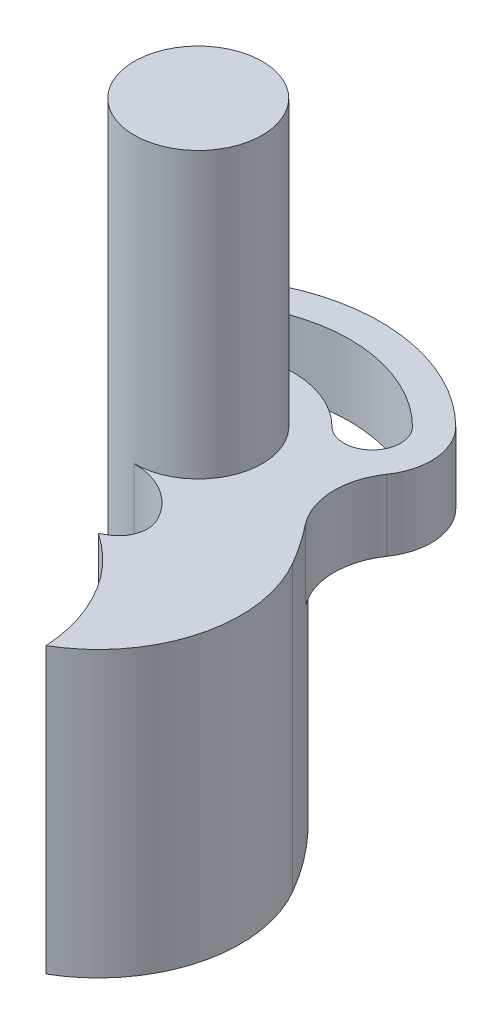
ISO-10303-21;
HEADER;
FILE_DESCRIPTION(('STEP AP214'),'2;1');
FILE_NAME('part.step','',(''),(''),'','','');
FILE_SCHEMA(('AUTOMOTIVE_DESIGN { 1 0 10303 214 1 1 1 1 }'));
ENDSEC;
DATA;
#1=APPLICATION_CONTEXT('core data for automotive mechanical design processes');
#2=APPLICATION_PROTOCOL_DEFINITION('international standard','automotive_design',2000,#1);
#3=PRODUCT_CONTEXT('',#1,'mechanical');
#4=PRODUCT('Part','Part','',(#3));
#5=PRODUCT_RELATED_PRODUCT_CATEGORY('part','',(#4));
#6=PRODUCT_DEFINITION_FORMATION('','',#4);
#7=PRODUCT_DEFINITION_CONTEXT('part definition',#1,'design');
#8=PRODUCT_DEFINITION('design','',#6,#7);
#9=PRODUCT_DEFINITION_SHAPE('','',#8);
#10=(LENGTH_UNIT() NAMED_UNIT(*) SI_UNIT(.MILLI.,.METRE.));
#11=(NAMED_UNIT(*) PLANE_ANGLE_UNIT() SI_UNIT($,.RADIAN.));
#12=(NAMED_UNIT(*) SI_UNIT($,.STERADIAN.) SOLID_ANGLE_UNIT());
#13=UNCERTAINTY_MEASURE_WITH_UNIT(LENGTH_MEASURE(1.E-05),#10,'distance_accuracy_value','');
#14=(GEOMETRIC_REPRESENTATION_CONTEXT(3) GLOBAL_UNCERTAINTY_ASSIGNED_CONTEXT((#13)) GLOBAL_UNIT_ASSIGNED_CONTEXT((#10,
#11,#12)) REPRESENTATION_CONTEXT('',''));
#15=CARTESIAN_POINT('',(0.,0.,0.));
#16=DIRECTION('',(0.,0.,1.));
#17=DIRECTION('',(1.,0.,0.));
#18=AXIS2_PLACEMENT_3D('',#15,#16,#17);
#19=CARTESIAN_POINT('',(0.,-20.,-17.5));
#20=DIRECTION('',(0.,1.,0.));
#21=DIRECTION('',(0.,0.,1.));
#22=AXIS2_PLACEMENT_3D('',#19,#20,#21);
#23=CYLINDRICAL_SURFACE('',#22,4.5);
#24=CARTESIAN_POINT('',(0.,20.,-17.5));
#25=DIRECTION('',(0.,1.,0.));
#26=DIRECTION('',(0.,0.,1.));
#27=AXIS2_PLACEMENT_3D('',#24,#25,#26);
#28=CIRCLE('',#27,4.5);
#29=CARTESIAN_POINT('',(0.,20.,-13.));
#30=VERTEX_POINT('',#29);
#31=EDGE_CURVE('E228',#30,#30,#28,.T.);
#32=ORIENTED_EDGE('',*,*,#31,.F.);
#33=EDGE_LOOP('',(#32));
#34=FACE_BOUND('',#33,.T.);
#35=CARTESIAN_POINT('',(0.,0.,-17.5));
#36=DIRECTION('',(0.,1.,0.));
#37=DIRECTION('',(0.,0.,1.));
#38=AXIS2_PLACEMENT_3D('',#35,#36,#37);
#39=CIRCLE('',#38,4.5);
#40=CARTESIAN_POINT('',(0.,0.,-13.));
#41=VERTEX_POINT('',#40);
#42=CARTESIAN_POINT('',(-4.48051561250782,0.,-17.0816940759759));
#43=VERTEX_POINT('',#42);
#44=EDGE_CURVE('E227',#41,#43,#39,.T.);
#45=ORIENTED_EDGE('',*,*,#44,.T.);
#46=DIRECTION('',(0.,1.,0.));
#47=VECTOR('',#46,1.);
#48=CARTESIAN_POINT('',(-4.48051561250782,-20.,-17.0816940759759));
#49=LINE('',#48,#47);
#50=CARTESIAN_POINT('',(-4.48051561250769,-5.,-17.0816940759759));
#51=VERTEX_POINT('',#50);
#52=EDGE_CURVE('E282',#43,#51,#49,.F.);
#53=ORIENTED_EDGE('',*,*,#52,.T.);
#54=CARTESIAN_POINT('',(1.43982048506075E-13,-5.,-17.5));
#55=DIRECTION('',(0.,-1.,0.));
#56=DIRECTION('',(0.,0.,1.));
#57=AXIS2_PLACEMENT_3D('',#54,#55,#56);
#58=CIRCLE('',#57,4.50000000000001);
#59=CARTESIAN_POINT('',(1.99233572089606,-5.,-21.5349223505839));
#60=VERTEX_POINT('',#59);
#61=EDGE_CURVE('E212',#51,#60,#58,.T.);
#62=ORIENTED_EDGE('',*,*,#61,.T.);
#63=DIRECTION('',(0.,1.,0.));
#64=VECTOR('',#63,1.);
#65=CARTESIAN_POINT('',(1.99233572089606,-20.,-21.5349223505839));
#66=LINE('',#65,#64);
#67=CARTESIAN_POINT('',(1.99233572089606,-20.,-21.5349223505839));
#68=VERTEX_POINT('',#67);
#69=EDGE_CURVE('E248',#68,#60,#66,.T.);
#70=ORIENTED_EDGE('',*,*,#69,.F.);
#71=CARTESIAN_POINT('',(0.,-20.,-17.5));
#72=DIRECTION('',(0.,1.,0.));
#73=DIRECTION('',(0.,0.,1.));
#74=AXIS2_PLACEMENT_3D('',#71,#72,#73);
#75=CIRCLE('',#74,4.5);
#76=CARTESIAN_POINT('',(0.,-20.,-13.));
#77=VERTEX_POINT('',#76);
#78=EDGE_CURVE('E236',#68,#77,#75,.T.);
#79=ORIENTED_EDGE('',*,*,#78,.T.);
#80=DIRECTION('',(0.,1.,0.));
#81=VECTOR('',#80,1.);
#82=CARTESIAN_POINT('',(0.,-20.,-13.));
#83=LINE('',#82,#81);
#84=EDGE_CURVE('E266',#77,#41,#83,.T.);
#85=ORIENTED_EDGE('',*,*,#84,.T.);
#86=EDGE_LOOP('',(#45,#53,#62,#70,#79,#85));
#87=FACE_BOUND('',#86,.T.);
#88=ADVANCED_FACE('F41',(#34,#87),#23,.T.);
#89=CARTESIAN_POINT('',(-8.09912658383888,-20.,-1.09746977851601));
#90=DIRECTION('',(0.,1.,0.));
#91=DIRECTION('',(0.,0.,1.));
#92=AXIS2_PLACEMENT_3D('',#89,#90,#91);
#93=CYLINDRICAL_SURFACE('',#92,22.7931366661855);
#94=CARTESIAN_POINT('',(-8.09912658383888,-5.,-1.09746977851601));
#95=DIRECTION('',(0.,1.,0.));
#96=DIRECTION('',(0.,0.,1.));
#97=AXIS2_PLACEMENT_3D('',#94,#95,#96);
#98=CIRCLE('',#97,22.7931366661855);
#99=CARTESIAN_POINT('',(9.7310619005618,-5.,-15.2964647321793));
#100=VERTEX_POINT('',#99);
#101=EDGE_CURVE('E223',#60,#100,#98,.F.);
#102=ORIENTED_EDGE('',*,*,#101,.T.);
#103=DIRECTION('',(0.,1.,0.));
#104=VECTOR('',#103,1.);
#105=CARTESIAN_POINT('',(9.7310619005618,-20.,-15.2964647321793));
#106=LINE('',#105,#104);
#107=CARTESIAN_POINT('',(9.73106190056181,0.,-15.2964647321793));
#108=VERTEX_POINT('',#107);
#109=EDGE_CURVE('E277',#100,#108,#106,.T.);
#110=ORIENTED_EDGE('',*,*,#109,.T.);
#111=CARTESIAN_POINT('',(-8.09912658383888,0.,-1.09746977851601));
#112=DIRECTION('',(0.,1.,0.));
#113=DIRECTION('',(0.,0.,1.));
#114=AXIS2_PLACEMENT_3D('',#111,#112,#113);
#115=CIRCLE('',#114,22.7931366661855);
#116=CARTESIAN_POINT('',(11.6403088010083,0.,-12.4940381116088));
#117=VERTEX_POINT('',#116);
#118=EDGE_CURVE('E231',#117,#108,#115,.T.);
#119=ORIENTED_EDGE('',*,*,#118,.F.);
#120=DIRECTION('',(0.,1.,0.));
#121=VECTOR('',#120,1.);
#122=CARTESIAN_POINT('',(11.6403088010083,-20.,-12.4940381116088));
#123=LINE('',#122,#121);
#124=CARTESIAN_POINT('',(11.6403088010083,-20.,-12.4940381116088));
#125=VERTEX_POINT('',#124);
#126=EDGE_CURVE('E257',#125,#117,#123,.T.);
#127=ORIENTED_EDGE('',*,*,#126,.F.);
#128=CARTESIAN_POINT('',(-8.09912658383888,-20.,-1.09746977851601));
#129=DIRECTION('',(0.,1.,0.));
#130=DIRECTION('',(0.,0.,1.));
#131=AXIS2_PLACEMENT_3D('',#128,#129,#130);
#132=CIRCLE('',#131,22.7931366661855);
#133=EDGE_CURVE('E233',#125,#68,#132,.T.);
#134=ORIENTED_EDGE('',*,*,#133,.T.);
#135=ORIENTED_EDGE('',*,*,#69,.T.);
#136=EDGE_LOOP('',(#102,#110,#119,#127,#134,#135));
#137=FACE_BOUND('',#136,.T.);
#138=ADVANCED_FACE('F324',(#137),#93,.T.);
#139=CARTESIAN_POINT('',(-3.24759526419164,-20.,1.875));
#140=DIRECTION('',(0.,1.,0.));
#141=DIRECTION('',(0.,0.,1.));
#142=AXIS2_PLACEMENT_3D('',#139,#140,#141);
#143=CYLINDRICAL_SURFACE('',#142,11.25);
#144=CARTESIAN_POINT('',(-3.24759526419164,0.,1.875));
#145=DIRECTION('',(0.,1.,0.));
#146=DIRECTION('',(0.,0.,1.));
#147=AXIS2_PLACEMENT_3D('',#144,#145,#146);
#148=CIRCLE('',#147,11.25);
#149=CARTESIAN_POINT('',(2.98005476316394,0.,-7.49403811160878));
#150=VERTEX_POINT('',#149);
#151=CARTESIAN_POINT('',(7.98005476316394,0.,1.1662159262356));
#152=VERTEX_POINT('',#151);
#153=EDGE_CURVE('E237',#150,#152,#148,.F.);
#154=ORIENTED_EDGE('',*,*,#153,.F.);
#155=DIRECTION('',(0.,1.,0.));
#156=VECTOR('',#155,1.);
#157=CARTESIAN_POINT('',(2.98005476316394,-20.,-7.49403811160878));
#158=LINE('',#157,#156);
#159=CARTESIAN_POINT('',(2.98005476316394,-20.,-7.49403811160878));
#160=VERTEX_POINT('',#159);
#161=EDGE_CURVE('E264',#160,#150,#158,.T.);
#162=ORIENTED_EDGE('',*,*,#161,.F.);
#163=CARTESIAN_POINT('',(-3.24759526419164,-20.,1.875));
#164=DIRECTION('',(0.,1.,0.));
#165=DIRECTION('',(0.,0.,1.));
#166=AXIS2_PLACEMENT_3D('',#163,#164,#165);
#167=CIRCLE('',#166,11.25);
#168=CARTESIAN_POINT('',(7.98005476316394,-20.,1.1662159262356));
#169=VERTEX_POINT('',#168);
#170=EDGE_CURVE('E245',#160,#169,#167,.F.);
#171=ORIENTED_EDGE('',*,*,#170,.T.);
#172=DIRECTION('',(0.,1.,0.));
#173=VECTOR('',#172,1.);
#174=CARTESIAN_POINT('',(7.98005476316394,-20.,1.1662159262356));
#175=LINE('',#174,#173);
#176=EDGE_CURVE('E261',#169,#152,#175,.T.);
#177=ORIENTED_EDGE('',*,*,#176,.T.);
#178=EDGE_LOOP('',(#154,#162,#171,#177));
#179=FACE_BOUND('',#178,.T.);
#180=ADVANCED_FACE('F331',(#179),#143,.F.);
#181=CARTESIAN_POINT('',(-2.5,-20.,-4.33012701892219));
#182=DIRECTION('',(0.5,0.,0.866025403784439));
#183=DIRECTION('',(0.866025403784439,0.,-0.5));
#184=AXIS2_PLACEMENT_3D('',#181,#182,#183);
#185=PLANE('',#184);
#186=DIRECTION('',(0.866025403784439,0.,-0.5));
#187=VECTOR('',#186,1.);
#188=CARTESIAN_POINT('',(-2.5,0.,-4.33012701892219));
#189=LINE('',#188,#187);
#190=CARTESIAN_POINT('',(3.43475820135043,0.,-7.7565612640472));
#191=VERTEX_POINT('',#190);
#192=EDGE_CURVE('E253',#150,#191,#189,.T.);
#193=ORIENTED_EDGE('',*,*,#192,.T.);
#194=DIRECTION('',(0.,1.,0.));
#195=VECTOR('',#194,1.);
#196=CARTESIAN_POINT('',(3.43475820135043,-20.,-7.7565612640472));
#197=LINE('',#196,#195);
#198=CARTESIAN_POINT('',(3.43475820135043,-20.,-7.7565612640472));
#199=VERTEX_POINT('',#198);
#200=EDGE_CURVE('E56',#191,#199,#197,.F.);
#201=ORIENTED_EDGE('',*,*,#200,.T.);
#202=DIRECTION('',(0.866025403784439,0.,-0.5));
#203=VECTOR('',#202,1.);
#204=CARTESIAN_POINT('',(-2.5,-20.,-4.33012701892219));
#205=LINE('',#204,#203);
#206=EDGE_CURVE('E243',#160,#199,#205,.T.);
#207=ORIENTED_EDGE('',*,*,#206,.F.);
#208=ORIENTED_EDGE('',*,*,#161,.T.);
#209=EDGE_LOOP('',(#193,#201,#207,#208));
#210=FACE_BOUND('',#209,.T.);
#211=ADVANCED_FACE('F374',(#210),#185,.F.);
#212=CARTESIAN_POINT('',(0.,-20.,-8.28317898572572));
#213=DIRECTION('',(0.,1.,0.));
#214=DIRECTION('',(0.,0.,1.));
#215=AXIS2_PLACEMENT_3D('',#212,#213,#214);
#216=CYLINDRICAL_SURFACE('',#215,4.71682101427428);
#217=CARTESIAN_POINT('',(0.,-20.,-8.28317898572572));
#218=DIRECTION('',(0.,1.,0.));
#219=DIRECTION('',(0.,0.,1.));
#220=AXIS2_PLACEMENT_3D('',#217,#218,#219);
#221=CIRCLE('',#220,4.71682101427428);
#222=CARTESIAN_POINT('',(4.2271163939278,-20.,-10.3759970554313));
#223=VERTEX_POINT('',#222);
#224=EDGE_CURVE('E240',#77,#223,#221,.F.);
#225=ORIENTED_EDGE('',*,*,#224,.T.);
#226=DIRECTION('',(0.,1.,0.));
#227=VECTOR('',#226,1.);
#228=CARTESIAN_POINT('',(4.2271163939278,-20.,-10.3759970554313));
#229=LINE('',#228,#227);
#230=CARTESIAN_POINT('',(4.2271163939278,0.,-10.3759970554313));
#231=VERTEX_POINT('',#230);
#232=EDGE_CURVE('E295',#223,#231,#229,.T.);
#233=ORIENTED_EDGE('',*,*,#232,.T.);
#234=CARTESIAN_POINT('',(0.,0.,-8.28317898572572));
#235=DIRECTION('',(0.,1.,0.));
#236=DIRECTION('',(0.,0.,1.));
#237=AXIS2_PLACEMENT_3D('',#234,#235,#236);
#238=CIRCLE('',#237,4.71682101427428);
#239=EDGE_CURVE('E251',#41,#231,#238,.F.);
#240=ORIENTED_EDGE('',*,*,#239,.F.);
#241=ORIENTED_EDGE('',*,*,#84,.F.);
#242=EDGE_LOOP('',(#225,#233,#240,#241));
#243=FACE_BOUND('',#242,.T.);
#244=ADVANCED_FACE('F300',(#243),#216,.F.);
#245=CARTESIAN_POINT('',(0.,-20.,0.));
#246=DIRECTION('',(0.,1.,0.));
#247=DIRECTION('',(0.,0.,1.));
#248=AXIS2_PLACEMENT_3D('',#245,#246,#247);
#249=PLANE('',#248);
#250=ORIENTED_EDGE('',*,*,#133,.F.);
#251=CARTESIAN_POINT('',(2.98005476316394,-20.,-7.49403811160878));
#252=DIRECTION('',(0.,1.,0.));
#253=DIRECTION('',(0.,0.,1.));
#254=AXIS2_PLACEMENT_3D('',#251,#252,#253);
#255=CIRCLE('',#254,10.);
#256=EDGE_CURVE('E272',#125,#169,#255,.F.);
#257=ORIENTED_EDGE('',*,*,#256,.T.);
#258=ORIENTED_EDGE('',*,*,#170,.F.);
#259=ORIENTED_EDGE('',*,*,#206,.T.);
#260=CARTESIAN_POINT('',(2.43475820135043,-20.,-9.48861207161608));
#261=DIRECTION('',(0.,1.,0.));
#262=DIRECTION('',(0.,0.,1.));
#263=AXIS2_PLACEMENT_3D('',#260,#261,#262);
#264=CIRCLE('',#263,2.);
#265=EDGE_CURVE('E11',#199,#223,#264,.T.);
#266=ORIENTED_EDGE('',*,*,#265,.T.);
#267=ORIENTED_EDGE('',*,*,#224,.F.);
#268=ORIENTED_EDGE('',*,*,#78,.F.);
#269=EDGE_LOOP('',(#250,#257,#258,#259,#266,#267,#268));
#270=FACE_BOUND('',#269,.T.);
#271=ADVANCED_FACE('F313',(#270),#249,.F.);
#272=CARTESIAN_POINT('',(0.,0.,0.));
#273=DIRECTION('',(0.,1.,0.));
#274=DIRECTION('',(0.,0.,1.));
#275=AXIS2_PLACEMENT_3D('',#272,#273,#274);
#276=PLANE('',#275);
#277=ORIENTED_EDGE('',*,*,#118,.T.);
#278=CARTESIAN_POINT('',(13.6423683489745,0.,-18.4112170283668));
#279=DIRECTION('',(0.,1.,0.));
#280=DIRECTION('',(0.,0.,1.));
#281=AXIS2_PLACEMENT_3D('',#278,#279,#280);
#282=CIRCLE('',#281,5.);
#283=CARTESIAN_POINT('',(9.53029472026864,0.,-21.2556590601371));
#284=VERTEX_POINT('',#283);
#285=EDGE_CURVE('E288',#108,#284,#282,.F.);
#286=ORIENTED_EDGE('',*,*,#285,.T.);
#287=CARTESIAN_POINT('',(6.11684347939477,0.,-23.6168434793947));
#288=DIRECTION('',(0.,1.,0.));
#289=DIRECTION('',(0.,0.,1.));
#290=AXIS2_PLACEMENT_3D('',#287,#288,#289);
#291=CIRCLE('',#290,4.15052300747366);
#292=CARTESIAN_POINT('',(9.0517064434504,0.,-26.5517064434503));
#293=VERTEX_POINT('',#292);
#294=EDGE_CURVE('E199',#284,#293,#291,.T.);
#295=ORIENTED_EDGE('',*,*,#294,.T.);
#296=CARTESIAN_POINT('',(1.43982048506075E-13,0.,-17.5));
#297=DIRECTION('',(0.,1.,0.));
#298=DIRECTION('',(0.,0.,1.));
#299=AXIS2_PLACEMENT_3D('',#296,#297,#298);
#300=CIRCLE('',#299,12.8010460149473);
#301=CARTESIAN_POINT('',(-7.3423783548191,0.,-27.9860030121815));
#302=VERTEX_POINT('',#301);
#303=EDGE_CURVE('E216',#293,#302,#300,.T.);
#304=ORIENTED_EDGE('',*,*,#303,.T.);
#305=CARTESIAN_POINT('',(-4.96173615919924,0.,-24.5860936057409));
#306=DIRECTION('',(0.,1.,0.));
#307=DIRECTION('',(0.,0.,1.));
#308=AXIS2_PLACEMENT_3D('',#305,#306,#307);
#309=CIRCLE('',#308,4.15052300747364);
#310=CARTESIAN_POINT('',(-7.0015585904414,0.,-20.9714061110092));
#311=VERTEX_POINT('',#310);
#312=EDGE_CURVE('E206',#302,#311,#309,.T.);
#313=ORIENTED_EDGE('',*,*,#312,.T.);
#314=CARTESIAN_POINT('',(-9.45886629307206,0.,-16.6169097159491));
#315=DIRECTION('',(0.,1.,0.));
#316=DIRECTION('',(0.,0.,1.));
#317=AXIS2_PLACEMENT_3D('',#314,#315,#316);
#318=CIRCLE('',#317,5.);
#319=EDGE_CURVE('E290',#311,#43,#318,.F.);
#320=ORIENTED_EDGE('',*,*,#319,.T.);
#321=ORIENTED_EDGE('',*,*,#44,.F.);
#322=ORIENTED_EDGE('',*,*,#239,.T.);
#323=CARTESIAN_POINT('',(2.43475820135043,0.,-9.48861207161608));
#324=DIRECTION('',(0.,1.,0.));
#325=DIRECTION('',(0.,0.,1.));
#326=AXIS2_PLACEMENT_3D('',#323,#324,#325);
#327=CIRCLE('',#326,2.);
#328=EDGE_CURVE('E49',#231,#191,#327,.F.);
#329=ORIENTED_EDGE('',*,*,#328,.T.);
#330=ORIENTED_EDGE('',*,*,#192,.F.);
#331=ORIENTED_EDGE('',*,*,#153,.T.);
#332=CARTESIAN_POINT('',(2.98005476316394,0.,-7.49403811160878));
#333=DIRECTION('',(0.,1.,0.));
#334=DIRECTION('',(0.,0.,1.));
#335=AXIS2_PLACEMENT_3D('',#332,#333,#334);
#336=CIRCLE('',#335,10.);
#337=EDGE_CURVE('E260',#152,#117,#336,.T.);
#338=ORIENTED_EDGE('',*,*,#337,.T.);
#339=EDGE_LOOP('',(#277,#286,#295,#304,#313,#320,#321,#322,#329,#330,#331,#338));
#340=FACE_BOUND('',#339,.T.);
#341=CARTESIAN_POINT('',(6.11684347939477,0.,-23.6168434793947));
#342=DIRECTION('',(0.,1.,0.));
#343=DIRECTION('',(0.,0.,1.));
#344=AXIS2_PLACEMENT_3D('',#341,#342,#343);
#345=CIRCLE('',#344,2.);
#346=CARTESIAN_POINT('',(4.7026299170217,0.,-22.2026299170217));
#347=VERTEX_POINT('',#346);
#348=CARTESIAN_POINT('',(7.53105704176793,0.,-25.0310570417679));
#349=VERTEX_POINT('',#348);
#350=EDGE_CURVE('E167',#347,#349,#345,.T.);
#351=ORIENTED_EDGE('',*,*,#350,.F.);
#352=CARTESIAN_POINT('',(1.43982048506075E-13,0.,-17.5));
#353=DIRECTION('',(0.,-1.,0.));
#354=DIRECTION('',(0.,0.,1.));
#355=AXIS2_PLACEMENT_3D('',#352,#353,#354);
#356=CIRCLE('',#355,6.65052300747346);
#357=CARTESIAN_POINT('',(-3.81458328649726,0.,-22.9477895171631));
#358=VERTEX_POINT('',#357);
#359=EDGE_CURVE('E184',#358,#347,#356,.T.);
#360=ORIENTED_EDGE('',*,*,#359,.F.);
#361=CARTESIAN_POINT('',(-4.96173615919936,0.,-24.5860936057411));
#362=DIRECTION('',(0.,1.,0.));
#363=DIRECTION('',(0.,0.,1.));
#364=AXIS2_PLACEMENT_3D('',#361,#362,#363);
#365=CIRCLE('',#364,2.);
#366=CARTESIAN_POINT('',(-6.1088890319013,0.,-26.2243976943188));
#367=VERTEX_POINT('',#366);
#368=EDGE_CURVE('E187',#367,#358,#365,.T.);
#369=ORIENTED_EDGE('',*,*,#368,.F.);
#370=CARTESIAN_POINT('',(1.43982048506075E-13,0.,-17.5));
#371=DIRECTION('',(0.,1.,0.));
#372=DIRECTION('',(0.,0.,1.));
#373=AXIS2_PLACEMENT_3D('',#370,#371,#372);
#374=CIRCLE('',#373,10.6505230074735);
#375=EDGE_CURVE('E193',#349,#367,#374,.T.);
#376=ORIENTED_EDGE('',*,*,#375,.F.);
#377=EDGE_LOOP('',(#351,#360,#369,#376));
#378=FACE_BOUND('',#377,.T.);
#379=ADVANCED_FACE('F305',(#340,#378),#276,.T.);
#380=CARTESIAN_POINT('',(2.98005476316394,-20.,-7.49403811160878));
#381=DIRECTION('',(0.,1.,0.));
#382=DIRECTION('',(0.,0.,1.));
#383=AXIS2_PLACEMENT_3D('',#380,#381,#382);
#384=CYLINDRICAL_SURFACE('',#383,10.);
#385=ORIENTED_EDGE('',*,*,#256,.F.);
#386=ORIENTED_EDGE('',*,*,#126,.T.);
#387=ORIENTED_EDGE('',*,*,#337,.F.);
#388=ORIENTED_EDGE('',*,*,#176,.F.);
#389=EDGE_LOOP('',(#385,#386,#387,#388));
#390=FACE_BOUND('',#389,.T.);
#391=ADVANCED_FACE('F338',(#390),#384,.T.);
#392=CARTESIAN_POINT('',(0.,20.,-17.5));
#393=DIRECTION('',(0.,1.,0.));
#394=DIRECTION('',(0.,0.,1.));
#395=AXIS2_PLACEMENT_3D('',#392,#393,#394);
#396=PLANE('',#395);
#397=ORIENTED_EDGE('',*,*,#31,.T.);
#398=EDGE_LOOP('',(#397));
#399=FACE_BOUND('',#398,.T.);
#400=ADVANCED_FACE('F341',(#399),#396,.T.);
#401=CARTESIAN_POINT('',(6.11684347939477,-5.,-23.6168434793947));
#402=DIRECTION('',(0.,1.,0.));
#403=DIRECTION('',(0.,0.,1.));
#404=AXIS2_PLACEMENT_3D('',#401,#402,#403);
#405=CYLINDRICAL_SURFACE('',#404,4.15052300747366);
#406=ORIENTED_EDGE('',*,*,#294,.F.);
#407=DIRECTION('',(0.,1.,0.));
#408=VECTOR('',#407,1.);
#409=CARTESIAN_POINT('',(9.53029472026864,-5.,-21.2556590601371));
#410=LINE('',#409,#408);
#411=CARTESIAN_POINT('',(9.53029472026864,-5.,-21.2556590601371));
#412=VERTEX_POINT('',#411);
#413=EDGE_CURVE('E274',#284,#412,#410,.F.);
#414=ORIENTED_EDGE('',*,*,#413,.T.);
#415=CARTESIAN_POINT('',(6.11684347939477,-5.,-23.6168434793947));
#416=DIRECTION('',(0.,1.,0.));
#417=DIRECTION('',(0.,0.,1.));
#418=AXIS2_PLACEMENT_3D('',#415,#416,#417);
#419=CIRCLE('',#418,4.15052300747366);
#420=CARTESIAN_POINT('',(9.0517064434504,-5.,-26.5517064434503));
#421=VERTEX_POINT('',#420);
#422=EDGE_CURVE('E203',#412,#421,#419,.T.);
#423=ORIENTED_EDGE('',*,*,#422,.T.);
#424=DIRECTION('',(0.,1.,0.));
#425=VECTOR('',#424,1.);
#426=CARTESIAN_POINT('',(9.0517064434504,-5.,-26.5517064434503));
#427=LINE('',#426,#425);
#428=EDGE_CURVE('E214',#421,#293,#427,.T.);
#429=ORIENTED_EDGE('',*,*,#428,.T.);
#430=EDGE_LOOP('',(#406,#414,#423,#429));
#431=FACE_BOUND('',#430,.T.);
#432=ADVANCED_FACE('F356',(#431),#405,.T.);
#433=CARTESIAN_POINT('',(-4.96173615919924,-5.,-24.5860936057409));
#434=DIRECTION('',(0.,1.,0.));
#435=DIRECTION('',(0.,0.,1.));
#436=AXIS2_PLACEMENT_3D('',#433,#434,#435);
#437=CYLINDRICAL_SURFACE('',#436,4.15052300747364);
#438=CARTESIAN_POINT('',(-4.96173615919924,-5.,-24.5860936057409));
#439=DIRECTION('',(0.,1.,0.));
#440=DIRECTION('',(0.,0.,1.));
#441=AXIS2_PLACEMENT_3D('',#438,#439,#440);
#442=CIRCLE('',#441,4.15052300747364);
#443=CARTESIAN_POINT('',(-7.3423783548191,-5.,-27.9860030121815));
#444=VERTEX_POINT('',#443);
#445=CARTESIAN_POINT('',(-7.0015585904414,-5.,-20.9714061110092));
#446=VERTEX_POINT('',#445);
#447=EDGE_CURVE('E209',#444,#446,#442,.T.);
#448=ORIENTED_EDGE('',*,*,#447,.T.);
#449=DIRECTION('',(0.,1.,0.));
#450=VECTOR('',#449,1.);
#451=CARTESIAN_POINT('',(-7.0015585904414,-5.,-20.9714061110092));
#452=LINE('',#451,#450);
#453=EDGE_CURVE('E279',#446,#311,#452,.T.);
#454=ORIENTED_EDGE('',*,*,#453,.T.);
#455=ORIENTED_EDGE('',*,*,#312,.F.);
#456=DIRECTION('',(0.,1.,0.));
#457=VECTOR('',#456,1.);
#458=CARTESIAN_POINT('',(-7.3423783548191,-5.,-27.9860030121815));
#459=LINE('',#458,#457);
#460=EDGE_CURVE('E221',#444,#302,#459,.T.);
#461=ORIENTED_EDGE('',*,*,#460,.F.);
#462=EDGE_LOOP('',(#448,#454,#455,#461));
#463=FACE_BOUND('',#462,.T.);
#464=ADVANCED_FACE('F365',(#463),#437,.T.);
#465=CARTESIAN_POINT('',(1.43982048506075E-13,-5.,-17.5));
#466=DIRECTION('',(0.,1.,0.));
#467=DIRECTION('',(0.,0.,1.));
#468=AXIS2_PLACEMENT_3D('',#465,#466,#467);
#469=CYLINDRICAL_SURFACE('',#468,12.8010460149473);
#470=ORIENTED_EDGE('',*,*,#303,.F.);
#471=ORIENTED_EDGE('',*,*,#428,.F.);
#472=CARTESIAN_POINT('',(1.43982048506075E-13,-5.,-17.5));
#473=DIRECTION('',(0.,1.,0.));
#474=DIRECTION('',(0.,0.,1.));
#475=AXIS2_PLACEMENT_3D('',#472,#473,#474);
#476=CIRCLE('',#475,12.8010460149473);
#477=EDGE_CURVE('E205',#421,#444,#476,.T.);
#478=ORIENTED_EDGE('',*,*,#477,.T.);
#479=ORIENTED_EDGE('',*,*,#460,.T.);
#480=EDGE_LOOP('',(#470,#471,#478,#479));
#481=FACE_BOUND('',#480,.T.);
#482=ADVANCED_FACE('F362',(#481),#469,.T.);
#483=CARTESIAN_POINT('',(3.05842173969746,-5.,-20.5584217396974));
#484=DIRECTION('',(0.,1.,0.));
#485=DIRECTION('',(0.,0.,1.));
#486=AXIS2_PLACEMENT_3D('',#483,#484,#485);
#487=PLANE('',#486);
#488=ORIENTED_EDGE('',*,*,#101,.F.);
#489=ORIENTED_EDGE('',*,*,#61,.F.);
#490=CARTESIAN_POINT('',(-9.45886629307206,-5.,-16.6169097159491));
#491=DIRECTION('',(0.,1.,0.));
#492=DIRECTION('',(0.,0.,1.));
#493=AXIS2_PLACEMENT_3D('',#490,#491,#492);
#494=CIRCLE('',#493,5.);
#495=EDGE_CURVE('E293',#51,#446,#494,.T.);
#496=ORIENTED_EDGE('',*,*,#495,.T.);
#497=ORIENTED_EDGE('',*,*,#447,.F.);
#498=ORIENTED_EDGE('',*,*,#477,.F.);
#499=ORIENTED_EDGE('',*,*,#422,.F.);
#500=CARTESIAN_POINT('',(13.6423683489745,-5.,-18.4112170283668));
#501=DIRECTION('',(0.,1.,0.));
#502=DIRECTION('',(0.,0.,1.));
#503=AXIS2_PLACEMENT_3D('',#500,#501,#502);
#504=CIRCLE('',#503,5.);
#505=EDGE_CURVE('E285',#412,#100,#504,.T.);
#506=ORIENTED_EDGE('',*,*,#505,.T.);
#507=EDGE_LOOP('',(#488,#489,#496,#497,#498,#499,#506));
#508=FACE_BOUND('',#507,.T.);
#509=CARTESIAN_POINT('',(1.43982048506075E-13,-5.,-17.5));
#510=DIRECTION('',(0.,-1.,0.));
#511=DIRECTION('',(0.,0.,1.));
#512=AXIS2_PLACEMENT_3D('',#509,#510,#511);
#513=CIRCLE('',#512,6.65052300747346);
#514=CARTESIAN_POINT('',(-3.81458328649726,-5.,-22.9477895171631));
#515=VERTEX_POINT('',#514);
#516=CARTESIAN_POINT('',(4.7026299170217,-5.,-22.2026299170217));
#517=VERTEX_POINT('',#516);
#518=EDGE_CURVE('E172',#515,#517,#513,.T.);
#519=ORIENTED_EDGE('',*,*,#518,.T.);
#520=CARTESIAN_POINT('',(6.11684347939477,-5.,-23.6168434793947));
#521=DIRECTION('',(0.,1.,0.));
#522=DIRECTION('',(0.,0.,1.));
#523=AXIS2_PLACEMENT_3D('',#520,#521,#522);
#524=CIRCLE('',#523,2.);
#525=CARTESIAN_POINT('',(7.53105704176793,-5.,-25.0310570417679));
#526=VERTEX_POINT('',#525);
#527=EDGE_CURVE('E164',#517,#526,#524,.T.);
#528=ORIENTED_EDGE('',*,*,#527,.T.);
#529=CARTESIAN_POINT('',(1.43982048506075E-13,-5.,-17.5));
#530=DIRECTION('',(0.,1.,0.));
#531=DIRECTION('',(0.,0.,1.));
#532=AXIS2_PLACEMENT_3D('',#529,#530,#531);
#533=CIRCLE('',#532,10.6505230074735);
#534=CARTESIAN_POINT('',(-6.1088890319013,-5.,-26.2243976943188));
#535=VERTEX_POINT('',#534);
#536=EDGE_CURVE('E176',#526,#535,#533,.T.);
#537=ORIENTED_EDGE('',*,*,#536,.T.);
#538=CARTESIAN_POINT('',(-4.96173615919936,-5.,-24.5860936057411));
#539=DIRECTION('',(0.,1.,0.));
#540=DIRECTION('',(0.,0.,1.));
#541=AXIS2_PLACEMENT_3D('',#538,#539,#540);
#542=CIRCLE('',#541,2.);
#543=EDGE_CURVE('E180',#535,#515,#542,.T.);
#544=ORIENTED_EDGE('',*,*,#543,.T.);
#545=EDGE_LOOP('',(#519,#528,#537,#544));
#546=FACE_BOUND('',#545,.T.);
#547=ADVANCED_FACE('F182',(#508,#546),#487,.F.);
#548=CARTESIAN_POINT('',(6.11684347939477,-5.,-23.6168434793947));
#549=DIRECTION('',(0.,1.,0.));
#550=DIRECTION('',(0.,0.,1.));
#551=AXIS2_PLACEMENT_3D('',#548,#549,#550);
#552=CYLINDRICAL_SURFACE('',#551,2.);
#553=ORIENTED_EDGE('',*,*,#350,.T.);
#554=DIRECTION('',(0.,1.,0.));
#555=VECTOR('',#554,1.);
#556=CARTESIAN_POINT('',(7.53105704176793,-5.,-25.0310570417679));
#557=LINE('',#556,#555);
#558=EDGE_CURVE('E160',#526,#349,#557,.T.);
#559=ORIENTED_EDGE('',*,*,#558,.F.);
#560=ORIENTED_EDGE('',*,*,#527,.F.);
#561=DIRECTION('',(0.,1.,0.));
#562=VECTOR('',#561,1.);
#563=CARTESIAN_POINT('',(4.7026299170217,-5.,-22.2026299170217));
#564=LINE('',#563,#562);
#565=EDGE_CURVE('E197',#517,#347,#564,.T.);
#566=ORIENTED_EDGE('',*,*,#565,.T.);
#567=EDGE_LOOP('',(#553,#559,#560,#566));
#568=FACE_BOUND('',#567,.T.);
#569=ADVANCED_FACE('F162',(#568),#552,.F.);
#570=CARTESIAN_POINT('',(1.43982048506075E-13,-5.,-17.5));
#571=DIRECTION('',(0.,1.,0.));
#572=DIRECTION('',(0.,0.,1.));
#573=AXIS2_PLACEMENT_3D('',#570,#571,#572);
#574=CYLINDRICAL_SURFACE('',#573,6.65052300747346);
#575=ORIENTED_EDGE('',*,*,#359,.T.);
#576=ORIENTED_EDGE('',*,*,#565,.F.);
#577=ORIENTED_EDGE('',*,*,#518,.F.);
#578=DIRECTION('',(0.,1.,0.));
#579=VECTOR('',#578,1.);
#580=CARTESIAN_POINT('',(-3.81458328649726,-5.,-22.9477895171631));
#581=LINE('',#580,#579);
#582=EDGE_CURVE('E200',#515,#358,#581,.T.);
#583=ORIENTED_EDGE('',*,*,#582,.T.);
#584=EDGE_LOOP('',(#575,#576,#577,#583));
#585=FACE_BOUND('',#584,.T.);
#586=ADVANCED_FACE('F396',(#585),#574,.T.);
#587=CARTESIAN_POINT('',(-4.96173615919936,-5.,-24.5860936057411));
#588=DIRECTION('',(0.,1.,0.));
#589=DIRECTION('',(0.,0.,1.));
#590=AXIS2_PLACEMENT_3D('',#587,#588,#589);
#591=CYLINDRICAL_SURFACE('',#590,2.);
#592=ORIENTED_EDGE('',*,*,#368,.T.);
#593=ORIENTED_EDGE('',*,*,#582,.F.);
#594=ORIENTED_EDGE('',*,*,#543,.F.);
#595=DIRECTION('',(0.,1.,0.));
#596=VECTOR('',#595,1.);
#597=CARTESIAN_POINT('',(-6.1088890319013,-5.,-26.2243976943188));
#598=LINE('',#597,#596);
#599=EDGE_CURVE('E171',#535,#367,#598,.T.);
#600=ORIENTED_EDGE('',*,*,#599,.T.);
#601=EDGE_LOOP('',(#592,#593,#594,#600));
#602=FACE_BOUND('',#601,.T.);
#603=ADVANCED_FACE('F348',(#602),#591,.F.);
#604=CARTESIAN_POINT('',(1.43982048506075E-13,-5.,-17.5));
#605=DIRECTION('',(0.,1.,0.));
#606=DIRECTION('',(0.,0.,1.));
#607=AXIS2_PLACEMENT_3D('',#604,#605,#606);
#608=CYLINDRICAL_SURFACE('',#607,10.6505230074735);
#609=ORIENTED_EDGE('',*,*,#375,.T.);
#610=ORIENTED_EDGE('',*,*,#599,.F.);
#611=ORIENTED_EDGE('',*,*,#536,.F.);
#612=ORIENTED_EDGE('',*,*,#558,.T.);
#613=EDGE_LOOP('',(#609,#610,#611,#612));
#614=FACE_BOUND('',#613,.T.);
#615=ADVANCED_FACE('F177',(#614),#608,.F.);
#616=CARTESIAN_POINT('',(13.6423683489745,-20.,-18.4112170283668));
#617=DIRECTION('',(0.,1.,0.));
#618=DIRECTION('',(0.,0.,1.));
#619=AXIS2_PLACEMENT_3D('',#616,#617,#618);
#620=CYLINDRICAL_SURFACE('',#619,5.);
#621=ORIENTED_EDGE('',*,*,#285,.F.);
#622=ORIENTED_EDGE('',*,*,#109,.F.);
#623=ORIENTED_EDGE('',*,*,#505,.F.);
#624=ORIENTED_EDGE('',*,*,#413,.F.);
#625=EDGE_LOOP('',(#621,#622,#623,#624));
#626=FACE_BOUND('',#625,.T.);
#627=ADVANCED_FACE('F321',(#626),#620,.F.);
#628=CARTESIAN_POINT('',(-9.45886629307206,-20.,-16.6169097159491));
#629=DIRECTION('',(0.,-1.,0.));
#630=DIRECTION('',(0.,0.,-1.));
#631=AXIS2_PLACEMENT_3D('',#628,#629,#630);
#632=CYLINDRICAL_SURFACE('',#631,5.);
#633=ORIENTED_EDGE('',*,*,#495,.F.);
#634=ORIENTED_EDGE('',*,*,#52,.F.);
#635=ORIENTED_EDGE('',*,*,#319,.F.);
#636=ORIENTED_EDGE('',*,*,#453,.F.);
#637=EDGE_LOOP('',(#633,#634,#635,#636));
#638=FACE_BOUND('',#637,.T.);
#639=ADVANCED_FACE('F316',(#638),#632,.F.);
#640=CARTESIAN_POINT('',(2.43475820135043,-20.,-9.48861207161608));
#641=DIRECTION('',(0.,1.,0.));
#642=DIRECTION('',(0.,0.,1.));
#643=AXIS2_PLACEMENT_3D('',#640,#641,#642);
#644=CYLINDRICAL_SURFACE('',#643,2.);
#645=ORIENTED_EDGE('',*,*,#265,.F.);
#646=ORIENTED_EDGE('',*,*,#200,.F.);
#647=ORIENTED_EDGE('',*,*,#328,.F.);
#648=ORIENTED_EDGE('',*,*,#232,.F.);
#649=EDGE_LOOP('',(#645,#646,#647,#648));
#650=FACE_BOUND('',#649,.T.);
#651=ADVANCED_FACE('F43',(#650),#644,.F.);
#652=CLOSED_SHELL('',(#88,#138,#180,#211,#244,#271,#379,#391,#400,#432,#464,#482,#547,#569,#586,
#603,#615,#627,#639,#651));
#653=MANIFOLD_SOLID_BREP('B2',#652);
#654=ADVANCED_BREP_SHAPE_REPRESENTATION('',(#18,#653),#14);
#655=SHAPE_DEFINITION_REPRESENTATION(#9,#654);
ENDSEC;
END-ISO-10303-21;
